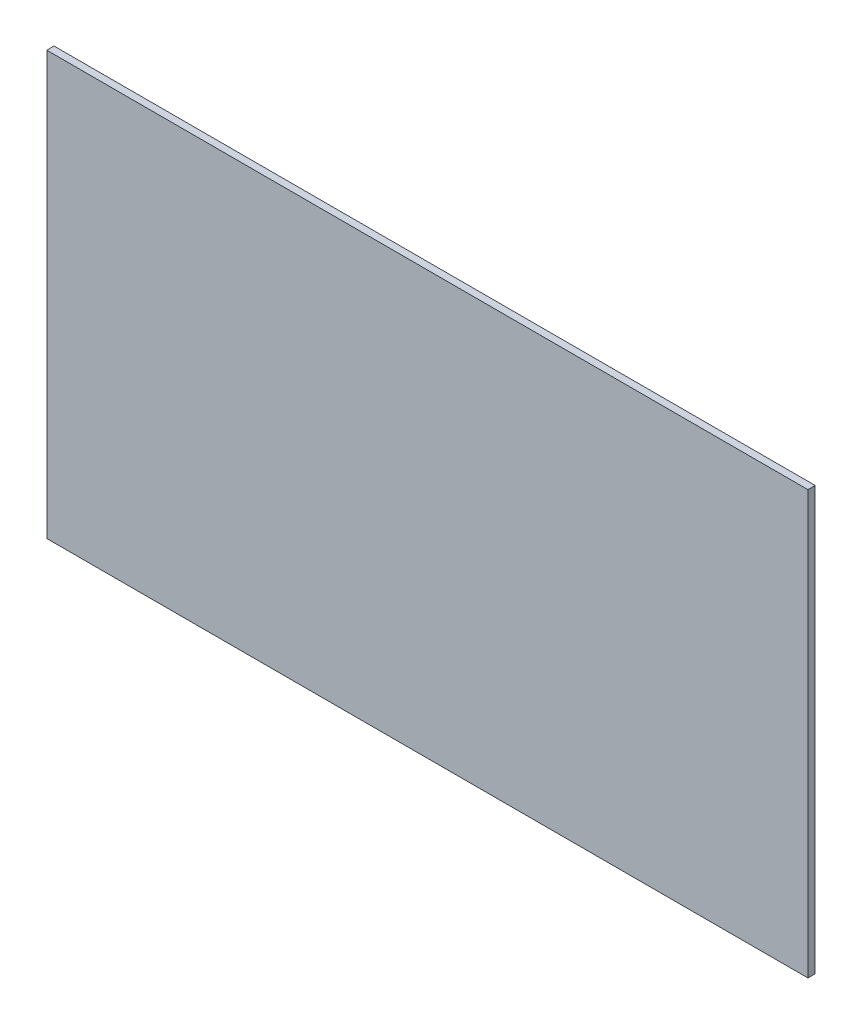
ISO-10303-21;
HEADER;
FILE_DESCRIPTION(('STEP AP214'),'2;1');
FILE_NAME('part.step','',(''),(''),'','','');
FILE_SCHEMA(('AUTOMOTIVE_DESIGN { 1 0 10303 214 1 1 1 1 }'));
ENDSEC;
DATA;
#1=APPLICATION_CONTEXT('core data for automotive mechanical design processes');
#2=APPLICATION_PROTOCOL_DEFINITION('international standard','automotive_design',2000,#1);
#3=PRODUCT_CONTEXT('',#1,'mechanical');
#4=PRODUCT('Part','Part','',(#3));
#5=PRODUCT_RELATED_PRODUCT_CATEGORY('part','',(#4));
#6=PRODUCT_DEFINITION_FORMATION('','',#4);
#7=PRODUCT_DEFINITION_CONTEXT('part definition',#1,'design');
#8=PRODUCT_DEFINITION('design','',#6,#7);
#9=PRODUCT_DEFINITION_SHAPE('','',#8);
#10=(LENGTH_UNIT() NAMED_UNIT(*) SI_UNIT(.MILLI.,.METRE.));
#11=(NAMED_UNIT(*) PLANE_ANGLE_UNIT() SI_UNIT($,.RADIAN.));
#12=(NAMED_UNIT(*) SI_UNIT($,.STERADIAN.) SOLID_ANGLE_UNIT());
#13=UNCERTAINTY_MEASURE_WITH_UNIT(LENGTH_MEASURE(1.E-05),#10,'distance_accuracy_value','');
#14=(GEOMETRIC_REPRESENTATION_CONTEXT(3) GLOBAL_UNCERTAINTY_ASSIGNED_CONTEXT((#13)) GLOBAL_UNIT_ASSIGNED_CONTEXT((#10,
#11,#12)) REPRESENTATION_CONTEXT('',''));
#15=CARTESIAN_POINT('',(0.,0.,0.));
#16=DIRECTION('',(0.,0.,1.));
#17=DIRECTION('',(1.,0.,0.));
#18=AXIS2_PLACEMENT_3D('',#15,#16,#17);
#19=CARTESIAN_POINT('',(-20.9348,-5.19682,0.86487));
#20=DIRECTION('',(1.,0.,0.));
#21=DIRECTION('',(0.,0.,1.));
#22=AXIS2_PLACEMENT_3D('',#19,#20,#21);
#23=PLANE('',#22);
#24=DIRECTION('',(0.,1.,0.));
#25=VECTOR('',#24,1.);
#26=CARTESIAN_POINT('',(-20.9348,-4.69682,0.882015));
#27=LINE('',#26,#25);
#28=CARTESIAN_POINT('',(-20.9348,-5.19682,0.882015));
#29=VERTEX_POINT('',#28);
#30=CARTESIAN_POINT('',(-20.9348,-4.19682,0.882015));
#31=VERTEX_POINT('',#30);
#32=EDGE_CURVE('E75',#29,#31,#27,.T.);
#33=ORIENTED_EDGE('',*,*,#32,.F.);
#34=DIRECTION('',(0.,0.,-1.));
#35=VECTOR('',#34,1.);
#36=CARTESIAN_POINT('',(-20.9348,-5.19682,0.8734425));
#37=LINE('',#36,#35);
#38=CARTESIAN_POINT('',(-20.9348,-5.19682,0.86487));
#39=VERTEX_POINT('',#38);
#40=EDGE_CURVE('E70',#29,#39,#37,.T.);
#41=ORIENTED_EDGE('',*,*,#40,.T.);
#42=DIRECTION('',(0.,1.,0.));
#43=VECTOR('',#42,1.);
#44=CARTESIAN_POINT('',(-20.9348,-5.19682,0.86487));
#45=LINE('',#44,#43);
#46=CARTESIAN_POINT('',(-20.9348,-4.19682,0.86487));
#47=VERTEX_POINT('',#46);
#48=EDGE_CURVE('E73',#39,#47,#45,.T.);
#49=ORIENTED_EDGE('',*,*,#48,.T.);
#50=DIRECTION('',(0.,0.,-1.));
#51=VECTOR('',#50,1.);
#52=CARTESIAN_POINT('',(-20.9348,-4.19682,0.8734425));
#53=LINE('',#52,#51);
#54=EDGE_CURVE('E11',#31,#47,#53,.T.);
#55=ORIENTED_EDGE('',*,*,#54,.F.);
#56=EDGE_LOOP('',(#33,#41,#49,#55));
#57=FACE_BOUND('',#56,.T.);
#58=ADVANCED_FACE('F16',(#57),#23,.T.);
#59=CARTESIAN_POINT('',(-20.9348,-4.19682,0.86487));
#60=DIRECTION('',(0.,1.,0.));
#61=DIRECTION('',(1.,0.,0.));
#62=AXIS2_PLACEMENT_3D('',#59,#60,#61);
#63=PLANE('',#62);
#64=DIRECTION('',(-1.,0.,0.));
#65=VECTOR('',#64,1.);
#66=CARTESIAN_POINT('',(-21.8348,-4.19682,0.882015));
#67=LINE('',#66,#65);
#68=CARTESIAN_POINT('',(-22.7348,-4.19682,0.882015));
#69=VERTEX_POINT('',#68);
#70=EDGE_CURVE('E103',#31,#69,#67,.T.);
#71=ORIENTED_EDGE('',*,*,#70,.F.);
#72=ORIENTED_EDGE('',*,*,#54,.T.);
#73=DIRECTION('',(-1.,0.,0.));
#74=VECTOR('',#73,1.);
#75=CARTESIAN_POINT('',(-20.9348,-4.19682,0.86487));
#76=LINE('',#75,#74);
#77=CARTESIAN_POINT('',(-22.7348,-4.19682,0.86487));
#78=VERTEX_POINT('',#77);
#79=EDGE_CURVE('E90',#47,#78,#76,.T.);
#80=ORIENTED_EDGE('',*,*,#79,.T.);
#81=DIRECTION('',(0.,0.,-1.));
#82=VECTOR('',#81,1.);
#83=CARTESIAN_POINT('',(-22.7348,-4.19682,0.8734425));
#84=LINE('',#83,#82);
#85=EDGE_CURVE('E27',#69,#78,#84,.T.);
#86=ORIENTED_EDGE('',*,*,#85,.F.);
#87=EDGE_LOOP('',(#71,#72,#80,#86));
#88=FACE_BOUND('',#87,.T.);
#89=ADVANCED_FACE('F120',(#88),#63,.T.);
#90=CARTESIAN_POINT('',(-22.7348,-4.19682,0.86487));
#91=DIRECTION('',(-1.,0.,0.));
#92=DIRECTION('',(0.,0.,1.));
#93=AXIS2_PLACEMENT_3D('',#90,#91,#92);
#94=PLANE('',#93);
#95=DIRECTION('',(0.,-1.,0.));
#96=VECTOR('',#95,1.);
#97=CARTESIAN_POINT('',(-22.7348,-4.69682,0.882015));
#98=LINE('',#97,#96);
#99=CARTESIAN_POINT('',(-22.7348,-5.19682,0.882015));
#100=VERTEX_POINT('',#99);
#101=EDGE_CURVE('E97',#69,#100,#98,.T.);
#102=ORIENTED_EDGE('',*,*,#101,.F.);
#103=ORIENTED_EDGE('',*,*,#85,.T.);
#104=DIRECTION('',(0.,-1.,0.));
#105=VECTOR('',#104,1.);
#106=CARTESIAN_POINT('',(-22.7348,-4.19682,0.86487));
#107=LINE('',#106,#105);
#108=CARTESIAN_POINT('',(-22.7348,-5.19682,0.86487));
#109=VERTEX_POINT('',#108);
#110=EDGE_CURVE('E87',#78,#109,#107,.T.);
#111=ORIENTED_EDGE('',*,*,#110,.T.);
#112=DIRECTION('',(0.,0.,-1.));
#113=VECTOR('',#112,1.);
#114=CARTESIAN_POINT('',(-22.7348,-5.19682,0.8734425));
#115=LINE('',#114,#113);
#116=EDGE_CURVE('E80',#100,#109,#115,.T.);
#117=ORIENTED_EDGE('',*,*,#116,.F.);
#118=EDGE_LOOP('',(#102,#103,#111,#117));
#119=FACE_BOUND('',#118,.T.);
#120=ADVANCED_FACE('F115',(#119),#94,.T.);
#121=CARTESIAN_POINT('',(-22.7348,-5.19682,0.86487));
#122=DIRECTION('',(0.,-1.,0.));
#123=DIRECTION('',(0.,0.,-1.));
#124=AXIS2_PLACEMENT_3D('',#121,#122,#123);
#125=PLANE('',#124);
#126=DIRECTION('',(1.,0.,0.));
#127=VECTOR('',#126,1.);
#128=CARTESIAN_POINT('',(-21.8348,-5.19682,0.882015));
#129=LINE('',#128,#127);
#130=EDGE_CURVE('E20',#100,#29,#129,.T.);
#131=ORIENTED_EDGE('',*,*,#130,.F.);
#132=ORIENTED_EDGE('',*,*,#116,.T.);
#133=DIRECTION('',(1.,0.,0.));
#134=VECTOR('',#133,1.);
#135=CARTESIAN_POINT('',(-22.7348,-5.19682,0.86487));
#136=LINE('',#135,#134);
#137=EDGE_CURVE('E83',#109,#39,#136,.T.);
#138=ORIENTED_EDGE('',*,*,#137,.T.);
#139=ORIENTED_EDGE('',*,*,#40,.F.);
#140=EDGE_LOOP('',(#131,#132,#138,#139));
#141=FACE_BOUND('',#140,.T.);
#142=ADVANCED_FACE('F18',(#141),#125,.T.);
#143=CARTESIAN_POINT('',(-21.8348,-4.69682,0.86487));
#144=DIRECTION('',(0.,0.,1.));
#145=DIRECTION('',(-1.,0.,0.));
#146=AXIS2_PLACEMENT_3D('',#143,#144,#145);
#147=PLANE('',#146);
#148=ORIENTED_EDGE('',*,*,#48,.F.);
#149=ORIENTED_EDGE('',*,*,#137,.F.);
#150=ORIENTED_EDGE('',*,*,#110,.F.);
#151=ORIENTED_EDGE('',*,*,#79,.F.);
#152=EDGE_LOOP('',(#148,#149,#150,#151));
#153=FACE_BOUND('',#152,.T.);
#154=ADVANCED_FACE('F89',(#153),#147,.F.);
#155=CARTESIAN_POINT('',(-21.8348,-4.69682,0.882015));
#156=DIRECTION('',(0.,0.,1.));
#157=DIRECTION('',(-1.,0.,0.));
#158=AXIS2_PLACEMENT_3D('',#155,#156,#157);
#159=PLANE('',#158);
#160=ORIENTED_EDGE('',*,*,#32,.T.);
#161=ORIENTED_EDGE('',*,*,#70,.T.);
#162=ORIENTED_EDGE('',*,*,#101,.T.);
#163=ORIENTED_EDGE('',*,*,#130,.T.);
#164=EDGE_LOOP('',(#160,#161,#162,#163));
#165=FACE_BOUND('',#164,.T.);
#166=ADVANCED_FACE('F128',(#165),#159,.T.);
#167=CLOSED_SHELL('',(#58,#89,#120,#142,#154,#166));
#168=MANIFOLD_SOLID_BREP('B1',#167);
#169=ADVANCED_BREP_SHAPE_REPRESENTATION('',(#18,#168),#14);
#170=SHAPE_DEFINITION_REPRESENTATION(#9,#169);
ENDSEC;
END-ISO-10303-21;
